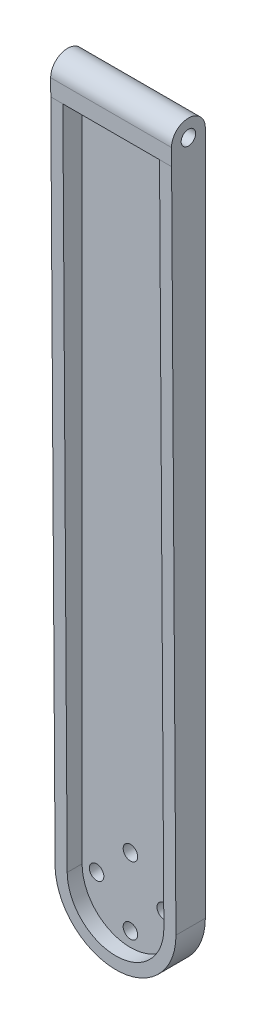
ISO-10303-21;
HEADER;
FILE_DESCRIPTION(('STEP AP214'),'2;1');
FILE_NAME('part.step','',(''),(''),'','','');
FILE_SCHEMA(('AUTOMOTIVE_DESIGN { 1 0 10303 214 1 1 1 1 }'));
ENDSEC;
DATA;
#1=APPLICATION_CONTEXT('core data for automotive mechanical design processes');
#2=APPLICATION_PROTOCOL_DEFINITION('international standard','automotive_design',2000,#1);
#3=PRODUCT_CONTEXT('',#1,'mechanical');
#4=PRODUCT('Part','Part','',(#3));
#5=PRODUCT_RELATED_PRODUCT_CATEGORY('part','',(#4));
#6=PRODUCT_DEFINITION_FORMATION('','',#4);
#7=PRODUCT_DEFINITION_CONTEXT('part definition',#1,'design');
#8=PRODUCT_DEFINITION('design','',#6,#7);
#9=PRODUCT_DEFINITION_SHAPE('','',#8);
#10=(LENGTH_UNIT() NAMED_UNIT(*) SI_UNIT(.MILLI.,.METRE.));
#11=(NAMED_UNIT(*) PLANE_ANGLE_UNIT() SI_UNIT($,.RADIAN.));
#12=(NAMED_UNIT(*) SI_UNIT($,.STERADIAN.) SOLID_ANGLE_UNIT());
#13=UNCERTAINTY_MEASURE_WITH_UNIT(LENGTH_MEASURE(1.E-05),#10,'distance_accuracy_value','');
#14=(GEOMETRIC_REPRESENTATION_CONTEXT(3) GLOBAL_UNCERTAINTY_ASSIGNED_CONTEXT((#13)) GLOBAL_UNIT_ASSIGNED_CONTEXT((#10,
#11,#12)) REPRESENTATION_CONTEXT('',''));
#15=CARTESIAN_POINT('',(0.,0.,0.));
#16=DIRECTION('',(0.,0.,1.));
#17=DIRECTION('',(1.,0.,0.));
#18=AXIS2_PLACEMENT_3D('',#15,#16,#17);
#19=CARTESIAN_POINT('',(0.,-62.8270098396662,3.));
#20=DIRECTION('',(0.,0.,1.));
#21=DIRECTION('',(1.,0.,0.));
#22=AXIS2_PLACEMENT_3D('',#19,#20,#21);
#23=PLANE('',#22);
#24=DIRECTION('',(0.,1.,0.));
#25=VECTOR('',#24,1.);
#26=CARTESIAN_POINT('',(-10.,72.8270098396662,3.));
#27=LINE('',#26,#25);
#28=CARTESIAN_POINT('',(-10.,-62.8270098396662,3.));
#29=VERTEX_POINT('',#28);
#30=CARTESIAN_POINT('',(-10.,75.3270098396662,3.));
#31=VERTEX_POINT('',#30);
#32=EDGE_CURVE('E176',#29,#31,#27,.T.);
#33=ORIENTED_EDGE('',*,*,#32,.F.);
#34=CARTESIAN_POINT('',(0.,-62.8270098396662,3.));
#35=DIRECTION('',(0.,0.,-1.));
#36=DIRECTION('',(1.,0.,0.));
#37=AXIS2_PLACEMENT_3D('',#34,#35,#36);
#38=CIRCLE('',#37,10.);
#39=CARTESIAN_POINT('',(10.,-62.8270098396662,3.));
#40=VERTEX_POINT('',#39);
#41=EDGE_CURVE('E172',#40,#29,#38,.T.);
#42=ORIENTED_EDGE('',*,*,#41,.F.);
#43=DIRECTION('',(0.,-1.,0.));
#44=VECTOR('',#43,1.);
#45=CARTESIAN_POINT('',(10.,-62.8270098396662,3.));
#46=LINE('',#45,#44);
#47=CARTESIAN_POINT('',(10.,75.3270098396662,3.));
#48=VERTEX_POINT('',#47);
#49=EDGE_CURVE('E128',#48,#40,#46,.T.);
#50=ORIENTED_EDGE('',*,*,#49,.F.);
#51=DIRECTION('',(-1.,0.,0.));
#52=VECTOR('',#51,1.);
#53=CARTESIAN_POINT('',(-12.5,75.3270098396662,3.));
#54=LINE('',#53,#52);
#55=EDGE_CURVE('E67',#48,#31,#54,.T.);
#56=ORIENTED_EDGE('',*,*,#55,.T.);
#57=EDGE_LOOP('',(#33,#42,#50,#56));
#58=FACE_BOUND('',#57,.T.);
#59=CARTESIAN_POINT('',(-7.,-62.8270098396661,3.));
#60=DIRECTION('',(0.,0.,1.));
#61=DIRECTION('',(1.,0.,0.));
#62=AXIS2_PLACEMENT_3D('',#59,#60,#61);
#63=CIRCLE('',#62,1.5);
#64=CARTESIAN_POINT('',(-5.5,-62.8270098396661,3.));
#65=VERTEX_POINT('',#64);
#66=EDGE_CURVE('E200',#65,#65,#63,.T.);
#67=ORIENTED_EDGE('',*,*,#66,.F.);
#68=EDGE_LOOP('',(#67));
#69=FACE_BOUND('',#68,.T.);
#70=CARTESIAN_POINT('',(7.,-62.8270098396662,3.));
#71=DIRECTION('',(0.,0.,1.));
#72=DIRECTION('',(1.,0.,0.));
#73=AXIS2_PLACEMENT_3D('',#70,#71,#72);
#74=CIRCLE('',#73,1.5);
#75=CARTESIAN_POINT('',(8.5,-62.8270098396662,3.));
#76=VERTEX_POINT('',#75);
#77=EDGE_CURVE('E216',#76,#76,#74,.T.);
#78=ORIENTED_EDGE('',*,*,#77,.F.);
#79=EDGE_LOOP('',(#78));
#80=FACE_BOUND('',#79,.T.);
#81=CARTESIAN_POINT('',(0.,-69.8270098396662,3.));
#82=DIRECTION('',(0.,0.,1.));
#83=DIRECTION('',(1.,0.,0.));
#84=AXIS2_PLACEMENT_3D('',#81,#82,#83);
#85=CIRCLE('',#84,1.5);
#86=CARTESIAN_POINT('',(1.49999999999997,-69.8270098396662,3.));
#87=VERTEX_POINT('',#86);
#88=EDGE_CURVE('E208',#87,#87,#85,.T.);
#89=ORIENTED_EDGE('',*,*,#88,.F.);
#90=EDGE_LOOP('',(#89));
#91=FACE_BOUND('',#90,.T.);
#92=CARTESIAN_POINT('',(0.,-55.8270098396662,3.));
#93=DIRECTION('',(0.,0.,1.));
#94=DIRECTION('',(1.,0.,0.));
#95=AXIS2_PLACEMENT_3D('',#92,#93,#94);
#96=CIRCLE('',#95,1.5);
#97=CARTESIAN_POINT('',(1.50000000000007,-55.8270098396662,3.));
#98=VERTEX_POINT('',#97);
#99=EDGE_CURVE('E192',#98,#98,#96,.T.);
#100=ORIENTED_EDGE('',*,*,#99,.F.);
#101=EDGE_LOOP('',(#100));
#102=FACE_BOUND('',#101,.T.);
#103=ADVANCED_FACE('F41',(#58,#69,#80,#91,#102),#23,.T.);
#104=CARTESIAN_POINT('',(0.,-62.8270098396662,0.));
#105=DIRECTION('',(0.,0.,1.));
#106=DIRECTION('',(1.,0.,0.));
#107=AXIS2_PLACEMENT_3D('',#104,#105,#106);
#108=PLANE('',#107);
#109=DIRECTION('',(0.,1.,0.));
#110=VECTOR('',#109,1.);
#111=CARTESIAN_POINT('',(12.5,-62.8270098396662,0.));
#112=LINE('',#111,#110);
#113=CARTESIAN_POINT('',(12.5,-62.8270098396662,0.));
#114=VERTEX_POINT('',#113);
#115=CARTESIAN_POINT('',(12.5,78.7911114548039,0.));
#116=VERTEX_POINT('',#115);
#117=EDGE_CURVE('E220',#114,#116,#112,.T.);
#118=ORIENTED_EDGE('',*,*,#117,.F.);
#119=CARTESIAN_POINT('',(0.,-62.8270098396662,0.));
#120=DIRECTION('',(0.,0.,1.));
#121=DIRECTION('',(1.,0.,0.));
#122=AXIS2_PLACEMENT_3D('',#119,#120,#121);
#123=CIRCLE('',#122,12.5);
#124=CARTESIAN_POINT('',(-12.5,-62.8270098396662,0.));
#125=VERTEX_POINT('',#124);
#126=EDGE_CURVE('E227',#125,#114,#123,.T.);
#127=ORIENTED_EDGE('',*,*,#126,.F.);
#128=DIRECTION('',(0.,-1.,0.));
#129=VECTOR('',#128,1.);
#130=CARTESIAN_POINT('',(-12.5,-62.8270098396662,0.));
#131=LINE('',#130,#129);
#132=CARTESIAN_POINT('',(-12.5,78.7911114548039,0.));
#133=VERTEX_POINT('',#132);
#134=EDGE_CURVE('E230',#133,#125,#131,.T.);
#135=ORIENTED_EDGE('',*,*,#134,.F.);
#136=DIRECTION('',(1.,0.,0.));
#137=VECTOR('',#136,1.);
#138=CARTESIAN_POINT('',(-12.5,78.7911114548039,0.));
#139=LINE('',#138,#137);
#140=EDGE_CURVE('E144',#133,#116,#139,.T.);
#141=ORIENTED_EDGE('',*,*,#140,.T.);
#142=EDGE_LOOP('',(#118,#127,#135,#141));
#143=FACE_BOUND('',#142,.T.);
#144=CARTESIAN_POINT('',(7.,-62.8270098396662,0.));
#145=DIRECTION('',(0.,0.,1.));
#146=DIRECTION('',(1.,0.,0.));
#147=AXIS2_PLACEMENT_3D('',#144,#145,#146);
#148=CIRCLE('',#147,1.5);
#149=CARTESIAN_POINT('',(8.5,-62.8270098396662,0.));
#150=VERTEX_POINT('',#149);
#151=EDGE_CURVE('E212',#150,#150,#148,.T.);
#152=ORIENTED_EDGE('',*,*,#151,.T.);
#153=EDGE_LOOP('',(#152));
#154=FACE_BOUND('',#153,.T.);
#155=CARTESIAN_POINT('',(0.,-69.8270098396662,0.));
#156=DIRECTION('',(0.,0.,1.));
#157=DIRECTION('',(1.,0.,0.));
#158=AXIS2_PLACEMENT_3D('',#155,#156,#157);
#159=CIRCLE('',#158,1.5);
#160=CARTESIAN_POINT('',(1.49999999999997,-69.8270098396662,0.));
#161=VERTEX_POINT('',#160);
#162=EDGE_CURVE('E204',#161,#161,#159,.T.);
#163=ORIENTED_EDGE('',*,*,#162,.T.);
#164=EDGE_LOOP('',(#163));
#165=FACE_BOUND('',#164,.T.);
#166=CARTESIAN_POINT('',(-7.,-62.8270098396661,0.));
#167=DIRECTION('',(0.,0.,1.));
#168=DIRECTION('',(1.,0.,0.));
#169=AXIS2_PLACEMENT_3D('',#166,#167,#168);
#170=CIRCLE('',#169,1.5);
#171=CARTESIAN_POINT('',(-5.5,-62.8270098396661,0.));
#172=VERTEX_POINT('',#171);
#173=EDGE_CURVE('E196',#172,#172,#170,.T.);
#174=ORIENTED_EDGE('',*,*,#173,.T.);
#175=EDGE_LOOP('',(#174));
#176=FACE_BOUND('',#175,.T.);
#177=CARTESIAN_POINT('',(0.,-55.8270098396662,0.));
#178=DIRECTION('',(0.,0.,1.));
#179=DIRECTION('',(1.,0.,0.));
#180=AXIS2_PLACEMENT_3D('',#177,#178,#179);
#181=CIRCLE('',#180,1.5);
#182=CARTESIAN_POINT('',(1.50000000000007,-55.8270098396662,0.));
#183=VERTEX_POINT('',#182);
#184=EDGE_CURVE('E191',#183,#183,#181,.T.);
#185=ORIENTED_EDGE('',*,*,#184,.T.);
#186=EDGE_LOOP('',(#185));
#187=FACE_BOUND('',#186,.T.);
#188=ADVANCED_FACE('F246',(#143,#154,#165,#176,#187),#108,.F.);
#189=CARTESIAN_POINT('',(12.5,-62.8270098396662,3.));
#190=DIRECTION('',(-1.,0.,0.));
#191=DIRECTION('',(0.,0.,1.));
#192=AXIS2_PLACEMENT_3D('',#189,#190,#191);
#193=PLANE('',#192);
#194=DIRECTION('',(0.,0.999978947508931,0.00648880103948387));
#195=VECTOR('',#194,1.);
#196=CARTESIAN_POINT('',(12.5,-0.0421036657378091,6.48852986777833));
#197=LINE('',#196,#195);
#198=CARTESIAN_POINT('',(12.5,75.3270098396662,6.97759534588378));
#199=VERTEX_POINT('',#198);
#200=CARTESIAN_POINT('',(12.5,78.7684006511657,6.99992631628126));
#201=VERTEX_POINT('',#200);
#202=EDGE_CURVE('E164',#199,#201,#197,.T.);
#203=ORIENTED_EDGE('',*,*,#202,.F.);
#204=DIRECTION('',(0.,0.999978947043533,0.00648887276086157));
#205=VECTOR('',#204,1.);
#206=CARTESIAN_POINT('',(12.5,-75.3270098396662,6.));
#207=LINE('',#206,#205);
#208=CARTESIAN_POINT('',(12.5,-62.8270098396662,6.08111261717117));
#209=VERTEX_POINT('',#208);
#210=EDGE_CURVE('E137',#209,#199,#207,.T.);
#211=ORIENTED_EDGE('',*,*,#210,.F.);
#212=DIRECTION('',(0.,0.,-1.));
#213=VECTOR('',#212,1.);
#214=CARTESIAN_POINT('',(12.5,-62.8270098396662,3.));
#215=LINE('',#214,#213);
#216=EDGE_CURVE('E226',#209,#114,#215,.T.);
#217=ORIENTED_EDGE('',*,*,#216,.T.);
#218=ORIENTED_EDGE('',*,*,#117,.T.);
#219=CARTESIAN_POINT('',(12.5,78.7911114548039,3.5));
#220=DIRECTION('',(1.,0.,0.));
#221=DIRECTION('',(0.,0.,-1.));
#222=AXIS2_PLACEMENT_3D('',#219,#220,#221);
#223=CIRCLE('',#222,3.5);
#224=EDGE_CURVE('E159',#116,#201,#223,.T.);
#225=ORIENTED_EDGE('',*,*,#224,.T.);
#226=EDGE_LOOP('',(#203,#211,#217,#218,#225));
#227=FACE_BOUND('',#226,.T.);
#228=CARTESIAN_POINT('',(12.5,78.7911114548039,3.5));
#229=DIRECTION('',(1.,0.,0.));
#230=DIRECTION('',(0.,0.,-1.));
#231=AXIS2_PLACEMENT_3D('',#228,#229,#230);
#232=CIRCLE('',#231,1.5);
#233=CARTESIAN_POINT('',(12.5,78.7911114548039,2.));
#234=VERTEX_POINT('',#233);
#235=EDGE_CURVE('E155',#234,#234,#232,.T.);
#236=ORIENTED_EDGE('',*,*,#235,.F.);
#237=EDGE_LOOP('',(#236));
#238=FACE_BOUND('',#237,.T.);
#239=ADVANCED_FACE('F43',(#227,#238),#193,.F.);
#240=CARTESIAN_POINT('',(-12.5,-62.8270098396662,3.));
#241=DIRECTION('',(1.,0.,0.));
#242=DIRECTION('',(0.,0.,-1.));
#243=AXIS2_PLACEMENT_3D('',#240,#241,#242);
#244=PLANE('',#243);
#245=DIRECTION('',(0.,0.,-1.));
#246=VECTOR('',#245,1.);
#247=CARTESIAN_POINT('',(-12.5,-62.8270098396662,3.));
#248=LINE('',#247,#246);
#249=CARTESIAN_POINT('',(-12.5,-62.8270098396662,6.08111261717117));
#250=VERTEX_POINT('',#249);
#251=EDGE_CURVE('E45',#250,#125,#248,.T.);
#252=ORIENTED_EDGE('',*,*,#251,.F.);
#253=DIRECTION('',(0.,0.999978947043533,0.00648887276086157));
#254=VECTOR('',#253,1.);
#255=CARTESIAN_POINT('',(-12.5,-75.3270098396662,6.));
#256=LINE('',#255,#254);
#257=CARTESIAN_POINT('',(-12.5,75.3270098396662,6.97759534588378));
#258=VERTEX_POINT('',#257);
#259=EDGE_CURVE('E120',#250,#258,#256,.T.);
#260=ORIENTED_EDGE('',*,*,#259,.T.);
#261=DIRECTION('',(0.,0.999978947508931,0.00648880103948387));
#262=VECTOR('',#261,1.);
#263=CARTESIAN_POINT('',(-12.5,-0.0421036657378091,6.48852986777833));
#264=LINE('',#263,#262);
#265=CARTESIAN_POINT('',(-12.5,78.7684006511657,6.99992631628126));
#266=VERTEX_POINT('',#265);
#267=EDGE_CURVE('E133',#258,#266,#264,.T.);
#268=ORIENTED_EDGE('',*,*,#267,.T.);
#269=CARTESIAN_POINT('',(-12.5,78.7911114548039,3.5));
#270=DIRECTION('',(1.,0.,0.));
#271=DIRECTION('',(0.,0.,-1.));
#272=AXIS2_PLACEMENT_3D('',#269,#270,#271);
#273=CIRCLE('',#272,3.5);
#274=EDGE_CURVE('E145',#133,#266,#273,.T.);
#275=ORIENTED_EDGE('',*,*,#274,.F.);
#276=ORIENTED_EDGE('',*,*,#134,.T.);
#277=EDGE_LOOP('',(#252,#260,#268,#275,#276));
#278=FACE_BOUND('',#277,.T.);
#279=CARTESIAN_POINT('',(-12.5,78.7911114548039,3.5));
#280=DIRECTION('',(1.,0.,0.));
#281=DIRECTION('',(0.,0.,-1.));
#282=AXIS2_PLACEMENT_3D('',#279,#280,#281);
#283=CIRCLE('',#282,1.5);
#284=CARTESIAN_POINT('',(-12.5,78.7911114548039,2.));
#285=VERTEX_POINT('',#284);
#286=EDGE_CURVE('E151',#285,#285,#283,.T.);
#287=ORIENTED_EDGE('',*,*,#286,.T.);
#288=EDGE_LOOP('',(#287));
#289=FACE_BOUND('',#288,.T.);
#290=ADVANCED_FACE('F130',(#278,#289),#244,.F.);
#291=CARTESIAN_POINT('',(0.,-62.8270098396662,3.));
#292=DIRECTION('',(0.,0.,-1.));
#293=DIRECTION('',(-1.,0.,0.));
#294=AXIS2_PLACEMENT_3D('',#291,#292,#293);
#295=CYLINDRICAL_SURFACE('',#294,12.5);
#296=CARTESIAN_POINT('',(0.,-62.8270098396662,6.08111261717117));
#297=DIRECTION('',(0.,0.00648887276086157,-0.999978947043533));
#298=DIRECTION('',(0.,-0.999978947043533,-0.00648887276086157));
#299=AXIS2_PLACEMENT_3D('',#296,#297,#298);
#300=ELLIPSE('',#299,12.5002631674963,12.5);
#301=EDGE_CURVE('E160',#209,#250,#300,.T.);
#302=ORIENTED_EDGE('',*,*,#301,.T.);
#303=ORIENTED_EDGE('',*,*,#251,.T.);
#304=ORIENTED_EDGE('',*,*,#126,.T.);
#305=ORIENTED_EDGE('',*,*,#216,.F.);
#306=EDGE_LOOP('',(#302,#303,#304,#305));
#307=FACE_BOUND('',#306,.T.);
#308=ADVANCED_FACE('F241',(#307),#295,.T.);
#309=CARTESIAN_POINT('',(7.,-62.8270098396662,3.));
#310=DIRECTION('',(0.,0.,-1.));
#311=DIRECTION('',(-1.,0.,0.));
#312=AXIS2_PLACEMENT_3D('',#309,#310,#311);
#313=CYLINDRICAL_SURFACE('',#312,1.5);
#314=ORIENTED_EDGE('',*,*,#77,.T.);
#315=EDGE_LOOP('',(#314));
#316=FACE_BOUND('',#315,.T.);
#317=ORIENTED_EDGE('',*,*,#151,.F.);
#318=EDGE_LOOP('',(#317));
#319=FACE_BOUND('',#318,.T.);
#320=ADVANCED_FACE('F298',(#316,#319),#313,.F.);
#321=CARTESIAN_POINT('',(0.,-69.8270098396662,3.));
#322=DIRECTION('',(0.,0.,-1.));
#323=DIRECTION('',(-1.,0.,0.));
#324=AXIS2_PLACEMENT_3D('',#321,#322,#323);
#325=CYLINDRICAL_SURFACE('',#324,1.5);
#326=ORIENTED_EDGE('',*,*,#88,.T.);
#327=EDGE_LOOP('',(#326));
#328=FACE_BOUND('',#327,.T.);
#329=ORIENTED_EDGE('',*,*,#162,.F.);
#330=EDGE_LOOP('',(#329));
#331=FACE_BOUND('',#330,.T.);
#332=ADVANCED_FACE('F305',(#328,#331),#325,.F.);
#333=CARTESIAN_POINT('',(-7.,-62.8270098396661,3.));
#334=DIRECTION('',(0.,0.,-1.));
#335=DIRECTION('',(-1.,0.,0.));
#336=AXIS2_PLACEMENT_3D('',#333,#334,#335);
#337=CYLINDRICAL_SURFACE('',#336,1.5);
#338=ORIENTED_EDGE('',*,*,#66,.T.);
#339=EDGE_LOOP('',(#338));
#340=FACE_BOUND('',#339,.T.);
#341=ORIENTED_EDGE('',*,*,#173,.F.);
#342=EDGE_LOOP('',(#341));
#343=FACE_BOUND('',#342,.T.);
#344=ADVANCED_FACE('F310',(#340,#343),#337,.F.);
#345=CARTESIAN_POINT('',(0.,-55.8270098396662,3.));
#346=DIRECTION('',(0.,0.,-1.));
#347=DIRECTION('',(-1.,0.,0.));
#348=AXIS2_PLACEMENT_3D('',#345,#346,#347);
#349=CYLINDRICAL_SURFACE('',#348,1.5);
#350=ORIENTED_EDGE('',*,*,#99,.T.);
#351=EDGE_LOOP('',(#350));
#352=FACE_BOUND('',#351,.T.);
#353=ORIENTED_EDGE('',*,*,#184,.F.);
#354=EDGE_LOOP('',(#353));
#355=FACE_BOUND('',#354,.T.);
#356=ADVANCED_FACE('F322',(#352,#355),#349,.F.);
#357=CARTESIAN_POINT('',(10.,-62.8270098396662,28.));
#358=DIRECTION('',(1.,0.,0.));
#359=DIRECTION('',(0.,0.,-1.));
#360=AXIS2_PLACEMENT_3D('',#357,#358,#359);
#361=PLANE('',#360);
#362=DIRECTION('',(0.,0.,-1.));
#363=VECTOR('',#362,1.);
#364=CARTESIAN_POINT('',(10.,-62.8270098396662,28.));
#365=LINE('',#364,#363);
#366=CARTESIAN_POINT('',(10.,-62.8270098396662,6.08111261717117));
#367=VERTEX_POINT('',#366);
#368=EDGE_CURVE('E185',#367,#40,#365,.T.);
#369=ORIENTED_EDGE('',*,*,#368,.F.);
#370=DIRECTION('',(0.,0.999978947043533,0.00648887276086157));
#371=VECTOR('',#370,1.);
#372=CARTESIAN_POINT('',(10.,-62.6847839627176,6.08203552221987));
#373=LINE('',#372,#371);
#374=CARTESIAN_POINT('',(10.,75.3270098396662,6.97759534588378));
#375=VERTEX_POINT('',#374);
#376=EDGE_CURVE('E255',#367,#375,#373,.T.);
#377=ORIENTED_EDGE('',*,*,#376,.T.);
#378=DIRECTION('',(0.,0.,-1.));
#379=VECTOR('',#378,1.);
#380=CARTESIAN_POINT('',(10.,75.3270098396662,28.));
#381=LINE('',#380,#379);
#382=EDGE_CURVE('E188',#375,#48,#381,.T.);
#383=ORIENTED_EDGE('',*,*,#382,.T.);
#384=ORIENTED_EDGE('',*,*,#49,.T.);
#385=EDGE_LOOP('',(#369,#377,#383,#384));
#386=FACE_BOUND('',#385,.T.);
#387=ADVANCED_FACE('F260',(#386),#361,.F.);
#388=CARTESIAN_POINT('',(0.,-62.8270098396662,28.));
#389=DIRECTION('',(0.,0.,-1.));
#390=DIRECTION('',(-1.,0.,0.));
#391=AXIS2_PLACEMENT_3D('',#388,#389,#390);
#392=CYLINDRICAL_SURFACE('',#391,10.);
#393=DIRECTION('',(0.,0.,-1.));
#394=VECTOR('',#393,1.);
#395=CARTESIAN_POINT('',(-10.,-62.8270098396662,28.));
#396=LINE('',#395,#394);
#397=CARTESIAN_POINT('',(-10.,-62.8270098396662,6.08111261717117));
#398=VERTEX_POINT('',#397);
#399=EDGE_CURVE('E60',#398,#29,#396,.T.);
#400=ORIENTED_EDGE('',*,*,#399,.F.);
#401=CARTESIAN_POINT('',(0.,-62.8270098396662,6.08111261717117));
#402=DIRECTION('',(0.,0.00648887276086157,-0.999978947043533));
#403=DIRECTION('',(0.,-0.999978947043533,-0.00648887276086157));
#404=AXIS2_PLACEMENT_3D('',#401,#402,#403);
#405=ELLIPSE('',#404,10.000210533997,10.);
#406=EDGE_CURVE('E262',#398,#367,#405,.F.);
#407=ORIENTED_EDGE('',*,*,#406,.T.);
#408=ORIENTED_EDGE('',*,*,#368,.T.);
#409=ORIENTED_EDGE('',*,*,#41,.T.);
#410=EDGE_LOOP('',(#400,#407,#408,#409));
#411=FACE_BOUND('',#410,.T.);
#412=ADVANCED_FACE('F270',(#411),#392,.F.);
#413=CARTESIAN_POINT('',(-10.,72.8270098396662,28.));
#414=DIRECTION('',(-1.,0.,0.));
#415=DIRECTION('',(0.,0.,1.));
#416=AXIS2_PLACEMENT_3D('',#413,#414,#415);
#417=PLANE('',#416);
#418=DIRECTION('',(0.,0.,-1.));
#419=VECTOR('',#418,1.);
#420=CARTESIAN_POINT('',(-10.,75.3270098396662,28.));
#421=LINE('',#420,#419);
#422=CARTESIAN_POINT('',(-10.,75.3270098396662,6.97759534588378));
#423=VERTEX_POINT('',#422);
#424=EDGE_CURVE('E179',#423,#31,#421,.T.);
#425=ORIENTED_EDGE('',*,*,#424,.F.);
#426=DIRECTION('',(0.,-0.999978947043533,-0.00648887276086157));
#427=VECTOR('',#426,1.);
#428=CARTESIAN_POINT('',(-10.,72.9635239403986,6.96225866372884));
#429=LINE('',#428,#427);
#430=EDGE_CURVE('E122',#423,#398,#429,.T.);
#431=ORIENTED_EDGE('',*,*,#430,.T.);
#432=ORIENTED_EDGE('',*,*,#399,.T.);
#433=ORIENTED_EDGE('',*,*,#32,.T.);
#434=EDGE_LOOP('',(#425,#431,#432,#433));
#435=FACE_BOUND('',#434,.T.);
#436=ADVANCED_FACE('F266',(#435),#417,.F.);
#437=CARTESIAN_POINT('',(-12.5,75.3270098396662,0.));
#438=DIRECTION('',(0.,1.,0.));
#439=DIRECTION('',(0.,0.,1.));
#440=AXIS2_PLACEMENT_3D('',#437,#438,#439);
#441=PLANE('',#440);
#442=DIRECTION('',(1.,0.,0.));
#443=VECTOR('',#442,1.);
#444=CARTESIAN_POINT('',(-12.5,75.3270098396662,6.97759534588378));
#445=LINE('',#444,#443);
#446=EDGE_CURVE('E53',#423,#375,#445,.T.);
#447=ORIENTED_EDGE('',*,*,#446,.F.);
#448=ORIENTED_EDGE('',*,*,#424,.T.);
#449=ORIENTED_EDGE('',*,*,#55,.F.);
#450=ORIENTED_EDGE('',*,*,#382,.F.);
#451=EDGE_LOOP('',(#447,#448,#449,#450));
#452=FACE_BOUND('',#451,.T.);
#453=ADVANCED_FACE('F265',(#452),#441,.F.);
#454=CARTESIAN_POINT('',(-12.5,-0.0421036657378091,6.48852986777833));
#455=DIRECTION('',(0.,0.00648880103948387,-0.999978947508931));
#456=DIRECTION('',(0.,0.999978947508931,0.00648880103948387));
#457=AXIS2_PLACEMENT_3D('',#454,#455,#456);
#458=PLANE('',#457);
#459=ORIENTED_EDGE('',*,*,#202,.T.);
#460=DIRECTION('',(1.,0.,0.));
#461=VECTOR('',#460,1.);
#462=CARTESIAN_POINT('',(-12.5,78.7684006511657,6.99992631628126));
#463=LINE('',#462,#461);
#464=EDGE_CURVE('E141',#266,#201,#463,.T.);
#465=ORIENTED_EDGE('',*,*,#464,.F.);
#466=ORIENTED_EDGE('',*,*,#267,.F.);
#467=EDGE_CURVE('E52',#258,#423,#445,.T.);
#468=ORIENTED_EDGE('',*,*,#467,.T.);
#469=ORIENTED_EDGE('',*,*,#446,.T.);
#470=EDGE_CURVE('E11',#375,#199,#445,.T.);
#471=ORIENTED_EDGE('',*,*,#470,.T.);
#472=EDGE_LOOP('',(#459,#465,#466,#468,#469,#471));
#473=FACE_BOUND('',#472,.T.);
#474=ADVANCED_FACE('F140',(#473),#458,.F.);
#475=CARTESIAN_POINT('',(-12.5,78.7911114548039,3.5));
#476=DIRECTION('',(1.,0.,0.));
#477=DIRECTION('',(0.,0.,-1.));
#478=AXIS2_PLACEMENT_3D('',#475,#476,#477);
#479=CYLINDRICAL_SURFACE('',#478,1.5);
#480=ORIENTED_EDGE('',*,*,#286,.F.);
#481=EDGE_LOOP('',(#480));
#482=FACE_BOUND('',#481,.T.);
#483=ORIENTED_EDGE('',*,*,#235,.T.);
#484=EDGE_LOOP('',(#483));
#485=FACE_BOUND('',#484,.T.);
#486=ADVANCED_FACE('F282',(#482,#485),#479,.F.);
#487=CARTESIAN_POINT('',(-12.5,78.7911114548039,3.5));
#488=DIRECTION('',(1.,0.,0.));
#489=DIRECTION('',(0.,0.,-1.));
#490=AXIS2_PLACEMENT_3D('',#487,#488,#489);
#491=CYLINDRICAL_SURFACE('',#490,3.5);
#492=ORIENTED_EDGE('',*,*,#224,.F.);
#493=ORIENTED_EDGE('',*,*,#140,.F.);
#494=ORIENTED_EDGE('',*,*,#274,.T.);
#495=ORIENTED_EDGE('',*,*,#464,.T.);
#496=EDGE_LOOP('',(#492,#493,#494,#495));
#497=FACE_BOUND('',#496,.T.);
#498=ADVANCED_FACE('F252',(#497),#491,.T.);
#499=CARTESIAN_POINT('',(-12.5,-75.3270098396662,6.));
#500=DIRECTION('',(0.,0.00648887276086157,-0.999978947043533));
#501=DIRECTION('',(0.,0.999978947043533,0.00648887276086157));
#502=AXIS2_PLACEMENT_3D('',#499,#500,#501);
#503=PLANE('',#502);
#504=ORIENTED_EDGE('',*,*,#301,.F.);
#505=ORIENTED_EDGE('',*,*,#210,.T.);
#506=ORIENTED_EDGE('',*,*,#470,.F.);
#507=ORIENTED_EDGE('',*,*,#376,.F.);
#508=ORIENTED_EDGE('',*,*,#406,.F.);
#509=ORIENTED_EDGE('',*,*,#430,.F.);
#510=ORIENTED_EDGE('',*,*,#467,.F.);
#511=ORIENTED_EDGE('',*,*,#259,.F.);
#512=EDGE_LOOP('',(#504,#505,#506,#507,#508,#509,#510,#511));
#513=FACE_BOUND('',#512,.T.);
#514=ADVANCED_FACE('F119',(#513),#503,.F.);
#515=CLOSED_SHELL('',(#103,#188,#239,#290,#308,#320,#332,#344,#356,#387,#412,#436,#453,#474,
#486,#498,#514));
#516=MANIFOLD_SOLID_BREP('B2',#515);
#517=ADVANCED_BREP_SHAPE_REPRESENTATION('',(#18,#516),#14);
#518=SHAPE_DEFINITION_REPRESENTATION(#9,#517);
ENDSEC;
END-ISO-10303-21;
